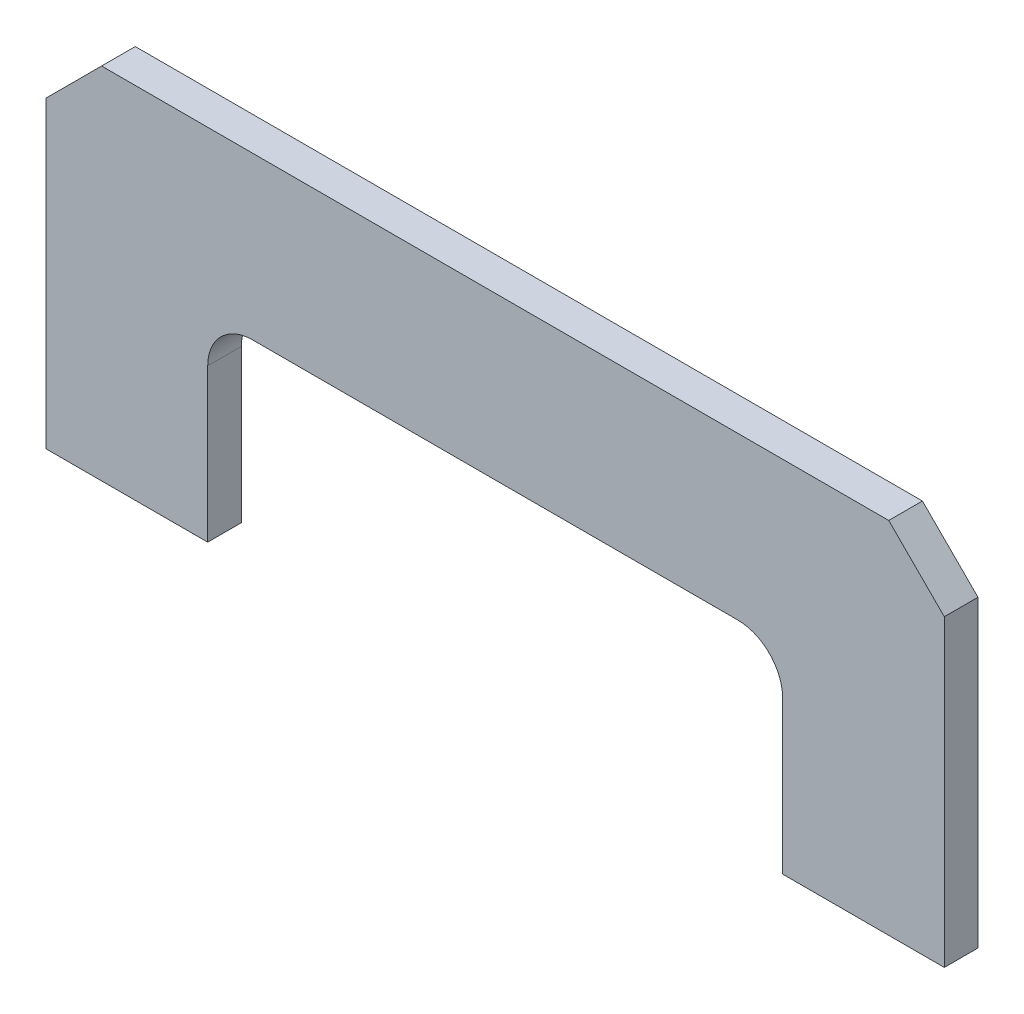
ISO-10303-21;
HEADER;
FILE_DESCRIPTION(('STEP AP214'),'2;1');
FILE_NAME('part.step','',(''),(''),'','','');
FILE_SCHEMA(('AUTOMOTIVE_DESIGN { 1 0 10303 214 1 1 1 1 }'));
ENDSEC;
DATA;
#1=APPLICATION_CONTEXT('core data for automotive mechanical design processes');
#2=APPLICATION_PROTOCOL_DEFINITION('international standard','automotive_design',2000,#1);
#3=PRODUCT_CONTEXT('',#1,'mechanical');
#4=PRODUCT('Part','Part','',(#3));
#5=PRODUCT_RELATED_PRODUCT_CATEGORY('part','',(#4));
#6=PRODUCT_DEFINITION_FORMATION('','',#4);
#7=PRODUCT_DEFINITION_CONTEXT('part definition',#1,'design');
#8=PRODUCT_DEFINITION('design','',#6,#7);
#9=PRODUCT_DEFINITION_SHAPE('','',#8);
#10=(LENGTH_UNIT() NAMED_UNIT(*) SI_UNIT(.MILLI.,.METRE.));
#11=(NAMED_UNIT(*) PLANE_ANGLE_UNIT() SI_UNIT($,.RADIAN.));
#12=(NAMED_UNIT(*) SI_UNIT($,.STERADIAN.) SOLID_ANGLE_UNIT());
#13=UNCERTAINTY_MEASURE_WITH_UNIT(LENGTH_MEASURE(1.E-05),#10,'distance_accuracy_value','');
#14=(GEOMETRIC_REPRESENTATION_CONTEXT(3) GLOBAL_UNCERTAINTY_ASSIGNED_CONTEXT((#13)) GLOBAL_UNIT_ASSIGNED_CONTEXT((#10,
#11,#12)) REPRESENTATION_CONTEXT('',''));
#15=CARTESIAN_POINT('',(0.,0.,0.));
#16=DIRECTION('',(0.,0.,1.));
#17=DIRECTION('',(1.,0.,0.));
#18=AXIS2_PLACEMENT_3D('',#15,#16,#17);
#19=CARTESIAN_POINT('',(0.,0.,2.38125));
#20=DIRECTION('',(1.,0.,0.));
#21=DIRECTION('',(0.,0.,-1.));
#22=AXIS2_PLACEMENT_3D('',#19,#20,#21);
#23=PLANE('',#22);
#24=DIRECTION('',(0.,-1.,0.));
#25=VECTOR('',#24,1.);
#26=CARTESIAN_POINT('',(0.,0.,2.38125));
#27=LINE('',#26,#25);
#28=CARTESIAN_POINT('',(0.,21.4711379470323,2.38125));
#29=VERTEX_POINT('',#28);
#30=CARTESIAN_POINT('',(0.,0.,2.38125));
#31=VERTEX_POINT('',#30);
#32=EDGE_CURVE('E136',#29,#31,#27,.T.);
#33=ORIENTED_EDGE('',*,*,#32,.F.);
#34=DIRECTION('',(0.,0.,1.));
#35=VECTOR('',#34,1.);
#36=CARTESIAN_POINT('',(0.,21.4711379470323,0.));
#37=LINE('',#36,#35);
#38=CARTESIAN_POINT('',(0.,21.4711379470323,0.));
#39=VERTEX_POINT('',#38);
#40=EDGE_CURVE('E352',#39,#29,#37,.T.);
#41=ORIENTED_EDGE('',*,*,#40,.F.);
#42=DIRECTION('',(0.,-1.,0.));
#43=VECTOR('',#42,1.);
#44=CARTESIAN_POINT('',(0.,0.,0.));
#45=LINE('',#44,#43);
#46=CARTESIAN_POINT('',(0.,0.,0.));
#47=VERTEX_POINT('',#46);
#48=EDGE_CURVE('E210',#39,#47,#45,.T.);
#49=ORIENTED_EDGE('',*,*,#48,.T.);
#50=DIRECTION('',(0.,0.,-1.));
#51=VECTOR('',#50,1.);
#52=CARTESIAN_POINT('',(0.,0.,2.38125));
#53=LINE('',#52,#51);
#54=EDGE_CURVE('E154',#31,#47,#53,.T.);
#55=ORIENTED_EDGE('',*,*,#54,.F.);
#56=EDGE_LOOP('',(#33,#41,#49,#55));
#57=FACE_BOUND('',#56,.T.);
#58=ADVANCED_FACE('F32',(#57),#23,.F.);
#59=CARTESIAN_POINT('',(0.,0.,2.38125));
#60=DIRECTION('',(0.,1.,0.));
#61=DIRECTION('',(0.,0.,1.));
#62=AXIS2_PLACEMENT_3D('',#59,#60,#61);
#63=PLANE('',#62);
#64=DIRECTION('',(1.,0.,0.));
#65=VECTOR('',#64,1.);
#66=CARTESIAN_POINT('',(0.,0.,0.));
#67=LINE('',#66,#65);
#68=CARTESIAN_POINT('',(11.43,0.,0.));
#69=VERTEX_POINT('',#68);
#70=EDGE_CURVE('E185',#47,#69,#67,.T.);
#71=ORIENTED_EDGE('',*,*,#70,.T.);
#72=DIRECTION('',(0.,0.,-1.));
#73=VECTOR('',#72,1.);
#74=CARTESIAN_POINT('',(11.43,0.,2.38125));
#75=LINE('',#74,#73);
#76=CARTESIAN_POINT('',(11.43,0.,2.38125));
#77=VERTEX_POINT('',#76);
#78=EDGE_CURVE('E151',#77,#69,#75,.T.);
#79=ORIENTED_EDGE('',*,*,#78,.F.);
#80=DIRECTION('',(1.,0.,0.));
#81=VECTOR('',#80,1.);
#82=CARTESIAN_POINT('',(0.,0.,2.38125));
#83=LINE('',#82,#81);
#84=EDGE_CURVE('E139',#31,#77,#83,.T.);
#85=ORIENTED_EDGE('',*,*,#84,.F.);
#86=ORIENTED_EDGE('',*,*,#54,.T.);
#87=EDGE_LOOP('',(#71,#79,#85,#86));
#88=FACE_BOUND('',#87,.T.);
#89=ADVANCED_FACE('F241',(#88),#63,.F.);
#90=CARTESIAN_POINT('',(11.43,0.,2.38125));
#91=DIRECTION('',(-1.,0.,0.));
#92=DIRECTION('',(0.,0.,1.));
#93=AXIS2_PLACEMENT_3D('',#90,#91,#92);
#94=PLANE('',#93);
#95=DIRECTION('',(0.,1.,0.));
#96=VECTOR('',#95,1.);
#97=CARTESIAN_POINT('',(11.43,0.,0.));
#98=LINE('',#97,#96);
#99=CARTESIAN_POINT('',(11.43,10.795,0.));
#100=VERTEX_POINT('',#99);
#101=EDGE_CURVE('E174',#69,#100,#98,.T.);
#102=ORIENTED_EDGE('',*,*,#101,.T.);
#103=DIRECTION('',(0.,0.,-1.));
#104=VECTOR('',#103,1.);
#105=CARTESIAN_POINT('',(11.43,10.795,2.38125));
#106=LINE('',#105,#104);
#107=CARTESIAN_POINT('',(11.43,10.795,2.38125));
#108=VERTEX_POINT('',#107);
#109=EDGE_CURVE('E165',#100,#108,#106,.F.);
#110=ORIENTED_EDGE('',*,*,#109,.T.);
#111=DIRECTION('',(0.,1.,0.));
#112=VECTOR('',#111,1.);
#113=CARTESIAN_POINT('',(11.43,0.,2.38125));
#114=LINE('',#113,#112);
#115=EDGE_CURVE('E195',#77,#108,#114,.T.);
#116=ORIENTED_EDGE('',*,*,#115,.F.);
#117=ORIENTED_EDGE('',*,*,#78,.T.);
#118=EDGE_LOOP('',(#102,#110,#116,#117));
#119=FACE_BOUND('',#118,.T.);
#120=ADVANCED_FACE('F181',(#119),#94,.F.);
#121=CARTESIAN_POINT('',(11.43,13.97,2.38125));
#122=DIRECTION('',(0.,1.,0.));
#123=DIRECTION('',(0.,0.,1.));
#124=AXIS2_PLACEMENT_3D('',#121,#122,#123);
#125=PLANE('',#124);
#126=DIRECTION('',(1.,0.,0.));
#127=VECTOR('',#126,1.);
#128=CARTESIAN_POINT('',(11.43,13.97,0.));
#129=LINE('',#128,#127);
#130=CARTESIAN_POINT('',(14.605,13.97,0.));
#131=VERTEX_POINT('',#130);
#132=CARTESIAN_POINT('',(48.895,13.97,0.));
#133=VERTEX_POINT('',#132);
#134=EDGE_CURVE('E176',#131,#133,#129,.T.);
#135=ORIENTED_EDGE('',*,*,#134,.T.);
#136=DIRECTION('',(0.,0.,-1.));
#137=VECTOR('',#136,1.);
#138=CARTESIAN_POINT('',(48.895,13.97,2.38125));
#139=LINE('',#138,#137);
#140=CARTESIAN_POINT('',(48.895,13.97,2.38125));
#141=VERTEX_POINT('',#140);
#142=EDGE_CURVE('E163',#133,#141,#139,.F.);
#143=ORIENTED_EDGE('',*,*,#142,.T.);
#144=DIRECTION('',(1.,0.,0.));
#145=VECTOR('',#144,1.);
#146=CARTESIAN_POINT('',(11.43,13.97,2.38125));
#147=LINE('',#146,#145);
#148=CARTESIAN_POINT('',(14.605,13.97,2.38125));
#149=VERTEX_POINT('',#148);
#150=EDGE_CURVE('E193',#149,#141,#147,.T.);
#151=ORIENTED_EDGE('',*,*,#150,.F.);
#152=DIRECTION('',(0.,0.,-1.));
#153=VECTOR('',#152,1.);
#154=CARTESIAN_POINT('',(14.605,13.97,0.));
#155=LINE('',#154,#153);
#156=EDGE_CURVE('E160',#149,#131,#155,.T.);
#157=ORIENTED_EDGE('',*,*,#156,.T.);
#158=EDGE_LOOP('',(#135,#143,#151,#157));
#159=FACE_BOUND('',#158,.T.);
#160=ADVANCED_FACE('F197',(#159),#125,.F.);
#161=CARTESIAN_POINT('',(52.07,0.,2.38125));
#162=DIRECTION('',(1.,0.,0.));
#163=DIRECTION('',(0.,1.,0.));
#164=AXIS2_PLACEMENT_3D('',#161,#162,#163);
#165=PLANE('',#164);
#166=DIRECTION('',(0.,-1.,0.));
#167=VECTOR('',#166,1.);
#168=CARTESIAN_POINT('',(52.07,0.,2.38125));
#169=LINE('',#168,#167);
#170=CARTESIAN_POINT('',(52.07,10.795,2.38125));
#171=VERTEX_POINT('',#170);
#172=CARTESIAN_POINT('',(52.07,0.,2.38125));
#173=VERTEX_POINT('',#172);
#174=EDGE_CURVE('E199',#171,#173,#169,.T.);
#175=ORIENTED_EDGE('',*,*,#174,.F.);
#176=DIRECTION('',(0.,0.,-1.));
#177=VECTOR('',#176,1.);
#178=CARTESIAN_POINT('',(52.07,10.795,0.));
#179=LINE('',#178,#177);
#180=CARTESIAN_POINT('',(52.07,10.795,0.));
#181=VERTEX_POINT('',#180);
#182=EDGE_CURVE('E157',#171,#181,#179,.T.);
#183=ORIENTED_EDGE('',*,*,#182,.T.);
#184=DIRECTION('',(0.,-1.,0.));
#185=VECTOR('',#184,1.);
#186=CARTESIAN_POINT('',(52.07,0.,0.));
#187=LINE('',#186,#185);
#188=CARTESIAN_POINT('',(52.07,0.,0.));
#189=VERTEX_POINT('',#188);
#190=EDGE_CURVE('E215',#181,#189,#187,.T.);
#191=ORIENTED_EDGE('',*,*,#190,.T.);
#192=DIRECTION('',(0.,0.,-1.));
#193=VECTOR('',#192,1.);
#194=CARTESIAN_POINT('',(52.07,0.,2.38125));
#195=LINE('',#194,#193);
#196=EDGE_CURVE('E148',#173,#189,#195,.T.);
#197=ORIENTED_EDGE('',*,*,#196,.F.);
#198=EDGE_LOOP('',(#175,#183,#191,#197));
#199=FACE_BOUND('',#198,.T.);
#200=ADVANCED_FACE('F229',(#199),#165,.F.);
#201=CARTESIAN_POINT('',(52.07,0.,2.38125));
#202=DIRECTION('',(0.,1.,0.));
#203=DIRECTION('',(0.,0.,1.));
#204=AXIS2_PLACEMENT_3D('',#201,#202,#203);
#205=PLANE('',#204);
#206=DIRECTION('',(1.,0.,0.));
#207=VECTOR('',#206,1.);
#208=CARTESIAN_POINT('',(52.07,0.,0.));
#209=LINE('',#208,#207);
#210=CARTESIAN_POINT('',(63.5,0.,0.));
#211=VERTEX_POINT('',#210);
#212=EDGE_CURVE('E141',#189,#211,#209,.T.);
#213=ORIENTED_EDGE('',*,*,#212,.T.);
#214=DIRECTION('',(0.,0.,-1.));
#215=VECTOR('',#214,1.);
#216=CARTESIAN_POINT('',(63.5,0.,2.38125));
#217=LINE('',#216,#215);
#218=CARTESIAN_POINT('',(63.5,0.,2.38125));
#219=VERTEX_POINT('',#218);
#220=EDGE_CURVE('E145',#219,#211,#217,.T.);
#221=ORIENTED_EDGE('',*,*,#220,.F.);
#222=DIRECTION('',(1.,0.,0.));
#223=VECTOR('',#222,1.);
#224=CARTESIAN_POINT('',(52.07,0.,2.38125));
#225=LINE('',#224,#223);
#226=EDGE_CURVE('E201',#173,#219,#225,.T.);
#227=ORIENTED_EDGE('',*,*,#226,.F.);
#228=ORIENTED_EDGE('',*,*,#196,.T.);
#229=EDGE_LOOP('',(#213,#221,#227,#228));
#230=FACE_BOUND('',#229,.T.);
#231=ADVANCED_FACE('F219',(#230),#205,.F.);
#232=CARTESIAN_POINT('',(63.5,0.,2.38125));
#233=DIRECTION('',(-1.,0.,0.));
#234=DIRECTION('',(0.,0.,1.));
#235=AXIS2_PLACEMENT_3D('',#232,#233,#234);
#236=PLANE('',#235);
#237=DIRECTION('',(0.,1.,0.));
#238=VECTOR('',#237,1.);
#239=CARTESIAN_POINT('',(63.5,0.,0.));
#240=LINE('',#239,#238);
#241=CARTESIAN_POINT('',(63.5,21.4711379470322,0.));
#242=VERTEX_POINT('',#241);
#243=EDGE_CURVE('E137',#211,#242,#240,.T.);
#244=ORIENTED_EDGE('',*,*,#243,.T.);
#245=DIRECTION('',(0.,0.,1.));
#246=VECTOR('',#245,1.);
#247=CARTESIAN_POINT('',(63.5,21.4711379470322,0.));
#248=LINE('',#247,#246);
#249=CARTESIAN_POINT('',(63.5,21.4711379470322,2.38125));
#250=VERTEX_POINT('',#249);
#251=EDGE_CURVE('E47',#242,#250,#248,.T.);
#252=ORIENTED_EDGE('',*,*,#251,.T.);
#253=DIRECTION('',(0.,1.,0.));
#254=VECTOR('',#253,1.);
#255=CARTESIAN_POINT('',(63.5,0.,2.38125));
#256=LINE('',#255,#254);
#257=EDGE_CURVE('E207',#219,#250,#256,.T.);
#258=ORIENTED_EDGE('',*,*,#257,.F.);
#259=ORIENTED_EDGE('',*,*,#220,.T.);
#260=EDGE_LOOP('',(#244,#252,#258,#259));
#261=FACE_BOUND('',#260,.T.);
#262=ADVANCED_FACE('F225',(#261),#236,.F.);
#263=CARTESIAN_POINT('',(0.,25.4,2.38125));
#264=DIRECTION('',(0.,-1.,0.));
#265=DIRECTION('',(0.,0.,-1.));
#266=AXIS2_PLACEMENT_3D('',#263,#264,#265);
#267=PLANE('',#266);
#268=DIRECTION('',(-1.,0.,0.));
#269=VECTOR('',#268,1.);
#270=CARTESIAN_POINT('',(0.,25.4,2.38125));
#271=LINE('',#270,#269);
#272=CARTESIAN_POINT('',(59.5711379470323,25.4,2.38125));
#273=VERTEX_POINT('',#272);
#274=CARTESIAN_POINT('',(3.92886205296777,25.4,2.38125));
#275=VERTEX_POINT('',#274);
#276=EDGE_CURVE('E130',#273,#275,#271,.T.);
#277=ORIENTED_EDGE('',*,*,#276,.F.);
#278=DIRECTION('',(0.,0.,1.));
#279=VECTOR('',#278,1.);
#280=CARTESIAN_POINT('',(59.5711379470323,25.4,0.));
#281=LINE('',#280,#279);
#282=CARTESIAN_POINT('',(59.5711379470323,25.4,0.));
#283=VERTEX_POINT('',#282);
#284=EDGE_CURVE('E121',#283,#273,#281,.T.);
#285=ORIENTED_EDGE('',*,*,#284,.F.);
#286=DIRECTION('',(-1.,0.,0.));
#287=VECTOR('',#286,1.);
#288=CARTESIAN_POINT('',(0.,25.4,0.));
#289=LINE('',#288,#287);
#290=CARTESIAN_POINT('',(3.92886205296777,25.4,0.));
#291=VERTEX_POINT('',#290);
#292=EDGE_CURVE('E55',#283,#291,#289,.T.);
#293=ORIENTED_EDGE('',*,*,#292,.T.);
#294=DIRECTION('',(0.,0.,1.));
#295=VECTOR('',#294,1.);
#296=CARTESIAN_POINT('',(3.92886205296777,25.4,0.));
#297=LINE('',#296,#295);
#298=EDGE_CURVE('E212',#291,#275,#297,.T.);
#299=ORIENTED_EDGE('',*,*,#298,.T.);
#300=EDGE_LOOP('',(#277,#285,#293,#299));
#301=FACE_BOUND('',#300,.T.);
#302=ADVANCED_FACE('F129',(#301),#267,.F.);
#303=CARTESIAN_POINT('',(0.,0.,2.38125));
#304=DIRECTION('',(0.,0.,-1.));
#305=DIRECTION('',(-1.,0.,0.));
#306=AXIS2_PLACEMENT_3D('',#303,#304,#305);
#307=PLANE('',#306);
#308=ORIENTED_EDGE('',*,*,#257,.T.);
#309=DIRECTION('',(0.707106781186542,-0.707106781186554,0.));
#310=VECTOR('',#309,1.);
#311=CARTESIAN_POINT('',(42.4855689735166,42.4855689735159,2.38125));
#312=LINE('',#311,#310);
#313=EDGE_CURVE('E126',#273,#250,#312,.T.);
#314=ORIENTED_EDGE('',*,*,#313,.F.);
#315=ORIENTED_EDGE('',*,*,#276,.T.);
#316=DIRECTION('',(0.707106781186551,0.707106781186544,0.));
#317=VECTOR('',#316,1.);
#318=CARTESIAN_POINT('',(-10.7355689735161,10.7355689735163,2.38125));
#319=LINE('',#318,#317);
#320=EDGE_CURVE('E350',#29,#275,#319,.T.);
#321=ORIENTED_EDGE('',*,*,#320,.F.);
#322=ORIENTED_EDGE('',*,*,#32,.T.);
#323=ORIENTED_EDGE('',*,*,#84,.T.);
#324=ORIENTED_EDGE('',*,*,#115,.T.);
#325=CARTESIAN_POINT('',(14.605,10.795,2.38125));
#326=DIRECTION('',(0.,0.,-1.));
#327=DIRECTION('',(-1.,0.,0.));
#328=AXIS2_PLACEMENT_3D('',#325,#326,#327);
#329=CIRCLE('',#328,3.175);
#330=EDGE_CURVE('E11',#108,#149,#329,.T.);
#331=ORIENTED_EDGE('',*,*,#330,.T.);
#332=ORIENTED_EDGE('',*,*,#150,.T.);
#333=CARTESIAN_POINT('',(48.895,10.795,2.38125));
#334=DIRECTION('',(0.,0.,-1.));
#335=DIRECTION('',(-1.,0.,0.));
#336=AXIS2_PLACEMENT_3D('',#333,#334,#335);
#337=CIRCLE('',#336,3.175);
#338=EDGE_CURVE('E169',#141,#171,#337,.T.);
#339=ORIENTED_EDGE('',*,*,#338,.T.);
#340=ORIENTED_EDGE('',*,*,#174,.T.);
#341=ORIENTED_EDGE('',*,*,#226,.T.);
#342=EDGE_LOOP('',(#308,#314,#315,#321,#322,#323,#324,#331,#332,#339,#340,#341));
#343=FACE_BOUND('',#342,.T.);
#344=ADVANCED_FACE('F192',(#343),#307,.F.);
#345=CARTESIAN_POINT('',(0.,0.,0.));
#346=DIRECTION('',(0.,0.,-1.));
#347=DIRECTION('',(-1.,0.,0.));
#348=AXIS2_PLACEMENT_3D('',#345,#346,#347);
#349=PLANE('',#348);
#350=DIRECTION('',(0.707106781186542,-0.707106781186554,0.));
#351=VECTOR('',#350,1.);
#352=CARTESIAN_POINT('',(42.4855689735166,42.4855689735159,0.));
#353=LINE('',#352,#351);
#354=EDGE_CURVE('E119',#283,#242,#353,.T.);
#355=ORIENTED_EDGE('',*,*,#354,.T.);
#356=ORIENTED_EDGE('',*,*,#243,.F.);
#357=ORIENTED_EDGE('',*,*,#212,.F.);
#358=ORIENTED_EDGE('',*,*,#190,.F.);
#359=CARTESIAN_POINT('',(48.895,10.795,0.));
#360=DIRECTION('',(0.,0.,-1.));
#361=DIRECTION('',(-1.,0.,0.));
#362=AXIS2_PLACEMENT_3D('',#359,#360,#361);
#363=CIRCLE('',#362,3.175);
#364=EDGE_CURVE('E167',#181,#133,#363,.F.);
#365=ORIENTED_EDGE('',*,*,#364,.T.);
#366=ORIENTED_EDGE('',*,*,#134,.F.);
#367=CARTESIAN_POINT('',(14.605,10.795,0.));
#368=DIRECTION('',(0.,0.,-1.));
#369=DIRECTION('',(-1.,0.,0.));
#370=AXIS2_PLACEMENT_3D('',#367,#368,#369);
#371=CIRCLE('',#370,3.175);
#372=EDGE_CURVE('E40',#131,#100,#371,.F.);
#373=ORIENTED_EDGE('',*,*,#372,.T.);
#374=ORIENTED_EDGE('',*,*,#101,.F.);
#375=ORIENTED_EDGE('',*,*,#70,.F.);
#376=ORIENTED_EDGE('',*,*,#48,.F.);
#377=DIRECTION('',(0.707106781186551,0.707106781186544,0.));
#378=VECTOR('',#377,1.);
#379=CARTESIAN_POINT('',(-10.7355689735161,10.7355689735163,0.));
#380=LINE('',#379,#378);
#381=EDGE_CURVE('E135',#39,#291,#380,.T.);
#382=ORIENTED_EDGE('',*,*,#381,.T.);
#383=ORIENTED_EDGE('',*,*,#292,.F.);
#384=EDGE_LOOP('',(#355,#356,#357,#358,#365,#366,#373,#374,#375,#376,#382,#383));
#385=FACE_BOUND('',#384,.T.);
#386=ADVANCED_FACE('F133',(#385),#349,.T.);
#387=CARTESIAN_POINT('',(48.895,10.795,2.38125));
#388=DIRECTION('',(0.,0.,1.));
#389=DIRECTION('',(1.,0.,0.));
#390=AXIS2_PLACEMENT_3D('',#387,#388,#389);
#391=CYLINDRICAL_SURFACE('',#390,3.175);
#392=ORIENTED_EDGE('',*,*,#338,.F.);
#393=ORIENTED_EDGE('',*,*,#142,.F.);
#394=ORIENTED_EDGE('',*,*,#364,.F.);
#395=ORIENTED_EDGE('',*,*,#182,.F.);
#396=EDGE_LOOP('',(#392,#393,#394,#395));
#397=FACE_BOUND('',#396,.T.);
#398=ADVANCED_FACE('F231',(#397),#391,.F.);
#399=CARTESIAN_POINT('',(14.605,10.795,2.38125));
#400=DIRECTION('',(0.,0.,1.));
#401=DIRECTION('',(1.,0.,0.));
#402=AXIS2_PLACEMENT_3D('',#399,#400,#401);
#403=CYLINDRICAL_SURFACE('',#402,3.175);
#404=ORIENTED_EDGE('',*,*,#330,.F.);
#405=ORIENTED_EDGE('',*,*,#109,.F.);
#406=ORIENTED_EDGE('',*,*,#372,.F.);
#407=ORIENTED_EDGE('',*,*,#156,.F.);
#408=EDGE_LOOP('',(#404,#405,#406,#407));
#409=FACE_BOUND('',#408,.T.);
#410=ADVANCED_FACE('F34',(#409),#403,.F.);
#411=CARTESIAN_POINT('',(-10.7355689735161,10.7355689735163,0.));
#412=DIRECTION('',(0.707106781186544,-0.707106781186551,0.));
#413=DIRECTION('',(0.707106781186551,0.707106781186544,0.));
#414=AXIS2_PLACEMENT_3D('',#411,#412,#413);
#415=PLANE('',#414);
#416=ORIENTED_EDGE('',*,*,#320,.T.);
#417=ORIENTED_EDGE('',*,*,#298,.F.);
#418=ORIENTED_EDGE('',*,*,#381,.F.);
#419=ORIENTED_EDGE('',*,*,#40,.T.);
#420=EDGE_LOOP('',(#416,#417,#418,#419));
#421=FACE_BOUND('',#420,.T.);
#422=ADVANCED_FACE('F237',(#421),#415,.F.);
#423=CARTESIAN_POINT('',(42.4855689735166,42.4855689735159,0.));
#424=DIRECTION('',(-0.707106781186553,-0.707106781186542,0.));
#425=DIRECTION('',(0.707106781186542,-0.707106781186553,0.));
#426=AXIS2_PLACEMENT_3D('',#423,#424,#425);
#427=PLANE('',#426);
#428=ORIENTED_EDGE('',*,*,#313,.T.);
#429=ORIENTED_EDGE('',*,*,#251,.F.);
#430=ORIENTED_EDGE('',*,*,#354,.F.);
#431=ORIENTED_EDGE('',*,*,#284,.T.);
#432=EDGE_LOOP('',(#428,#429,#430,#431));
#433=FACE_BOUND('',#432,.T.);
#434=ADVANCED_FACE('F120',(#433),#427,.F.);
#435=CLOSED_SHELL('',(#58,#89,#120,#160,#200,#231,#262,#302,#344,#386,#398,#410,#422,#434));
#436=MANIFOLD_SOLID_BREP('B2',#435);
#437=ADVANCED_BREP_SHAPE_REPRESENTATION('',(#18,#436),#14);
#438=SHAPE_DEFINITION_REPRESENTATION(#9,#437);
ENDSEC;
END-ISO-10303-21;
